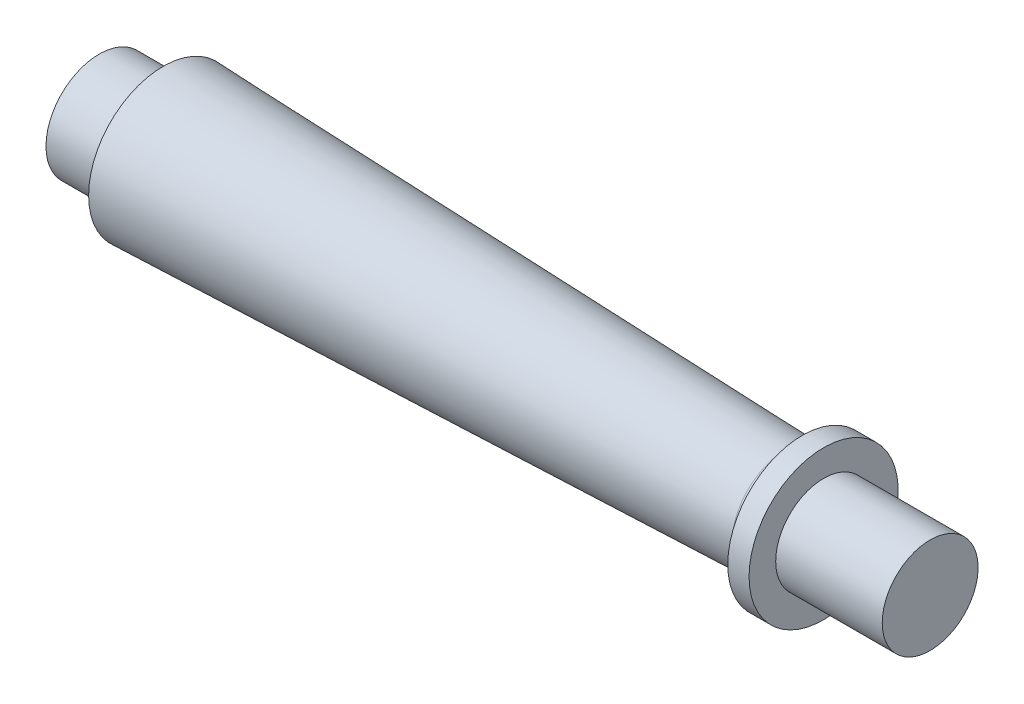
ISO-10303-21;
HEADER;
FILE_DESCRIPTION(('STEP AP214'),'2;1');
FILE_NAME('part.step','',(''),(''),'','','');
FILE_SCHEMA(('AUTOMOTIVE_DESIGN { 1 0 10303 214 1 1 1 1 }'));
ENDSEC;
DATA;
#1=APPLICATION_CONTEXT('core data for automotive mechanical design processes');
#2=APPLICATION_PROTOCOL_DEFINITION('international standard','automotive_design',2000,#1);
#3=PRODUCT_CONTEXT('',#1,'mechanical');
#4=PRODUCT('Part','Part','',(#3));
#5=PRODUCT_RELATED_PRODUCT_CATEGORY('part','',(#4));
#6=PRODUCT_DEFINITION_FORMATION('','',#4);
#7=PRODUCT_DEFINITION_CONTEXT('part definition',#1,'design');
#8=PRODUCT_DEFINITION('design','',#6,#7);
#9=PRODUCT_DEFINITION_SHAPE('','',#8);
#10=(LENGTH_UNIT() NAMED_UNIT(*) SI_UNIT(.MILLI.,.METRE.));
#11=(NAMED_UNIT(*) PLANE_ANGLE_UNIT() SI_UNIT($,.RADIAN.));
#12=(NAMED_UNIT(*) SI_UNIT($,.STERADIAN.) SOLID_ANGLE_UNIT());
#13=UNCERTAINTY_MEASURE_WITH_UNIT(LENGTH_MEASURE(1.E-05),#10,'distance_accuracy_value','');
#14=(GEOMETRIC_REPRESENTATION_CONTEXT(3) GLOBAL_UNCERTAINTY_ASSIGNED_CONTEXT((#13)) GLOBAL_UNIT_ASSIGNED_CONTEXT((#10,
#11,#12)) REPRESENTATION_CONTEXT('',''));
#15=CARTESIAN_POINT('',(0.,0.,0.));
#16=DIRECTION('',(0.,0.,1.));
#17=DIRECTION('',(1.,0.,0.));
#18=AXIS2_PLACEMENT_3D('',#15,#16,#17);
#19=CARTESIAN_POINT('',(0.,5.,0.));
#20=DIRECTION('',(1.,0.,0.));
#21=DIRECTION('',(0.,0.,-1.));
#22=AXIS2_PLACEMENT_3D('',#19,#20,#21);
#23=PLANE('',#22);
#24=CARTESIAN_POINT('',(0.,0.,0.));
#25=DIRECTION('',(-1.,0.,0.));
#26=DIRECTION('',(0.,0.,1.));
#27=AXIS2_PLACEMENT_3D('',#24,#25,#26);
#28=CIRCLE('',#27,5.);
#29=CARTESIAN_POINT('',(0.,0.,5.));
#30=VERTEX_POINT('',#29);
#31=EDGE_CURVE('E69',#30,#30,#28,.T.);
#32=ORIENTED_EDGE('',*,*,#31,.T.);
#33=EDGE_LOOP('',(#32));
#34=FACE_BOUND('',#33,.T.);
#35=ADVANCED_FACE('F37',(#34),#23,.F.);
#36=CARTESIAN_POINT('',(78.,0.,0.));
#37=DIRECTION('',(-1.,0.,0.));
#38=DIRECTION('',(0.,0.,1.));
#39=AXIS2_PLACEMENT_3D('',#36,#37,#38);
#40=PLANE('',#39);
#41=CARTESIAN_POINT('',(78.,0.,0.));
#42=DIRECTION('',(-1.,0.,0.));
#43=DIRECTION('',(0.,0.,1.));
#44=AXIS2_PLACEMENT_3D('',#41,#42,#43);
#45=CIRCLE('',#44,4.50000000000001);
#46=CARTESIAN_POINT('',(78.,0.,4.50000000000001));
#47=VERTEX_POINT('',#46);
#48=EDGE_CURVE('E48',#47,#47,#45,.T.);
#49=ORIENTED_EDGE('',*,*,#48,.F.);
#50=EDGE_LOOP('',(#49));
#51=FACE_BOUND('',#50,.T.);
#52=ADVANCED_FACE('F96',(#51),#40,.F.);
#53=CARTESIAN_POINT('',(0.,0.,0.));
#54=DIRECTION('',(-1.,0.,0.));
#55=DIRECTION('',(0.,0.,1.));
#56=AXIS2_PLACEMENT_3D('',#53,#54,#55);
#57=CYLINDRICAL_SURFACE('',#56,4.50000000000001);
#58=CARTESIAN_POINT('',(68.,0.,0.));
#59=DIRECTION('',(-1.,0.,0.));
#60=DIRECTION('',(0.,0.,1.));
#61=AXIS2_PLACEMENT_3D('',#58,#59,#60);
#62=CIRCLE('',#61,4.5);
#63=CARTESIAN_POINT('',(68.,0.,4.5));
#64=VERTEX_POINT('',#63);
#65=EDGE_CURVE('E52',#64,#64,#62,.T.);
#66=ORIENTED_EDGE('',*,*,#65,.F.);
#67=EDGE_LOOP('',(#66));
#68=FACE_BOUND('',#67,.T.);
#69=ORIENTED_EDGE('',*,*,#48,.T.);
#70=EDGE_LOOP('',(#69));
#71=FACE_BOUND('',#70,.T.);
#72=ADVANCED_FACE('F100',(#68,#71),#57,.T.);
#73=CARTESIAN_POINT('',(68.,4.5,0.));
#74=DIRECTION('',(-1.,0.,0.));
#75=DIRECTION('',(0.,0.,1.));
#76=AXIS2_PLACEMENT_3D('',#73,#74,#75);
#77=PLANE('',#76);
#78=CARTESIAN_POINT('',(68.,0.,0.));
#79=DIRECTION('',(-1.,0.,0.));
#80=DIRECTION('',(0.,0.,1.));
#81=AXIS2_PLACEMENT_3D('',#78,#79,#80);
#82=CIRCLE('',#81,7.);
#83=CARTESIAN_POINT('',(68.,0.,7.));
#84=VERTEX_POINT('',#83);
#85=EDGE_CURVE('E57',#84,#84,#82,.T.);
#86=ORIENTED_EDGE('',*,*,#85,.F.);
#87=EDGE_LOOP('',(#86));
#88=FACE_BOUND('',#87,.T.);
#89=ORIENTED_EDGE('',*,*,#65,.T.);
#90=EDGE_LOOP('',(#89));
#91=FACE_BOUND('',#90,.T.);
#92=ADVANCED_FACE('F106',(#88,#91),#77,.F.);
#93=CARTESIAN_POINT('',(0.,0.,0.));
#94=DIRECTION('',(-1.,0.,0.));
#95=DIRECTION('',(0.,0.,1.));
#96=AXIS2_PLACEMENT_3D('',#93,#94,#95);
#97=CYLINDRICAL_SURFACE('',#96,7.);
#98=CARTESIAN_POINT('',(66.,0.,0.));
#99=DIRECTION('',(-1.,0.,0.));
#100=DIRECTION('',(0.,0.,1.));
#101=AXIS2_PLACEMENT_3D('',#98,#99,#100);
#102=CIRCLE('',#101,7.);
#103=CARTESIAN_POINT('',(66.,0.,7.));
#104=VERTEX_POINT('',#103);
#105=EDGE_CURVE('E60',#104,#104,#102,.T.);
#106=ORIENTED_EDGE('',*,*,#105,.F.);
#107=EDGE_LOOP('',(#106));
#108=FACE_BOUND('',#107,.T.);
#109=ORIENTED_EDGE('',*,*,#85,.T.);
#110=EDGE_LOOP('',(#109));
#111=FACE_BOUND('',#110,.T.);
#112=ADVANCED_FACE('F93',(#108,#111),#97,.T.);
#113=CARTESIAN_POINT('',(66.,7.,0.));
#114=DIRECTION('',(1.,0.,0.));
#115=DIRECTION('',(0.,0.,-1.));
#116=AXIS2_PLACEMENT_3D('',#113,#114,#115);
#117=PLANE('',#116);
#118=CARTESIAN_POINT('',(66.,0.,0.));
#119=DIRECTION('',(1.,0.,0.));
#120=DIRECTION('',(0.,0.,-1.));
#121=AXIS2_PLACEMENT_3D('',#118,#119,#120);
#122=CIRCLE('',#121,6.55083310198036);
#123=CARTESIAN_POINT('',(66.,0.,-6.55083310198036));
#124=VERTEX_POINT('',#123);
#125=EDGE_CURVE('E10',#124,#124,#122,.T.);
#126=ORIENTED_EDGE('',*,*,#125,.T.);
#127=EDGE_LOOP('',(#126));
#128=FACE_BOUND('',#127,.T.);
#129=ORIENTED_EDGE('',*,*,#105,.T.);
#130=EDGE_LOOP('',(#129));
#131=FACE_BOUND('',#130,.T.);
#132=ADVANCED_FACE('F88',(#128,#131),#117,.F.);
#133=CARTESIAN_POINT('',(66.,0.,0.));
#134=DIRECTION('',(-1.,0.,0.));
#135=DIRECTION('',(0.,0.,1.));
#136=AXIS2_PLACEMENT_3D('',#133,#134,#135);
#137=CONICAL_SURFACE('',#136,5.,0.0333209958782472);
#138=CARTESIAN_POINT('',(64.450027754651,0.,0.));
#139=DIRECTION('',(-1.,0.,0.));
#140=DIRECTION('',(0.,0.,1.));
#141=AXIS2_PLACEMENT_3D('',#138,#139,#140);
#142=CIRCLE('',#141,5.05166574151163);
#143=CARTESIAN_POINT('',(64.450027754651,0.,5.05166574151163));
#144=VERTEX_POINT('',#143);
#145=EDGE_CURVE('E44',#144,#144,#142,.T.);
#146=ORIENTED_EDGE('',*,*,#145,.T.);
#147=EDGE_LOOP('',(#146));
#148=FACE_BOUND('',#147,.T.);
#149=CARTESIAN_POINT('',(6.,0.,0.));
#150=DIRECTION('',(-1.,0.,0.));
#151=DIRECTION('',(0.,0.,1.));
#152=AXIS2_PLACEMENT_3D('',#149,#150,#151);
#153=CIRCLE('',#152,7.);
#154=CARTESIAN_POINT('',(6.,0.,7.));
#155=VERTEX_POINT('',#154);
#156=EDGE_CURVE('E63',#155,#155,#153,.T.);
#157=ORIENTED_EDGE('',*,*,#156,.F.);
#158=EDGE_LOOP('',(#157));
#159=FACE_BOUND('',#158,.T.);
#160=ADVANCED_FACE('F83',(#148,#159),#137,.T.);
#161=CARTESIAN_POINT('',(6.,7.,0.));
#162=DIRECTION('',(1.,0.,0.));
#163=DIRECTION('',(0.,0.,-1.));
#164=AXIS2_PLACEMENT_3D('',#161,#162,#163);
#165=PLANE('',#164);
#166=CARTESIAN_POINT('',(6.,0.,0.));
#167=DIRECTION('',(-1.,0.,0.));
#168=DIRECTION('',(0.,0.,1.));
#169=AXIS2_PLACEMENT_3D('',#166,#167,#168);
#170=CIRCLE('',#169,5.);
#171=CARTESIAN_POINT('',(6.,0.,5.));
#172=VERTEX_POINT('',#171);
#173=EDGE_CURVE('E66',#172,#172,#170,.T.);
#174=ORIENTED_EDGE('',*,*,#173,.F.);
#175=EDGE_LOOP('',(#174));
#176=FACE_BOUND('',#175,.T.);
#177=ORIENTED_EDGE('',*,*,#156,.T.);
#178=EDGE_LOOP('',(#177));
#179=FACE_BOUND('',#178,.T.);
#180=ADVANCED_FACE('F77',(#176,#179),#165,.F.);
#181=CARTESIAN_POINT('',(0.,0.,0.));
#182=DIRECTION('',(-1.,0.,0.));
#183=DIRECTION('',(0.,0.,1.));
#184=AXIS2_PLACEMENT_3D('',#181,#182,#183);
#185=CYLINDRICAL_SURFACE('',#184,5.);
#186=ORIENTED_EDGE('',*,*,#31,.F.);
#187=EDGE_LOOP('',(#186));
#188=FACE_BOUND('',#187,.T.);
#189=ORIENTED_EDGE('',*,*,#173,.T.);
#190=EDGE_LOOP('',(#189));
#191=FACE_BOUND('',#190,.T.);
#192=ADVANCED_FACE('F74',(#188,#191),#185,.T.);
#193=CARTESIAN_POINT('',(64.5,0.,0.));
#194=DIRECTION('',(1.,0.,0.));
#195=DIRECTION('',(0.,0.,-1.));
#196=AXIS2_PLACEMENT_3D('',#193,#194,#195);
#197=TOROIDAL_SURFACE('',#196,6.55083310198036,1.5);
#198=ORIENTED_EDGE('',*,*,#125,.F.);
#199=EDGE_LOOP('',(#198));
#200=FACE_BOUND('',#199,.T.);
#201=ORIENTED_EDGE('',*,*,#145,.F.);
#202=EDGE_LOOP('',(#201));
#203=FACE_BOUND('',#202,.T.);
#204=ADVANCED_FACE('F39',(#200,#203),#197,.F.);
#205=CLOSED_SHELL('',(#35,#52,#72,#92,#112,#132,#160,#180,#192,#204));
#206=MANIFOLD_SOLID_BREP('B2',#205);
#207=ADVANCED_BREP_SHAPE_REPRESENTATION('',(#18,#206),#14);
#208=SHAPE_DEFINITION_REPRESENTATION(#9,#207);
ENDSEC;
END-ISO-10303-21;
